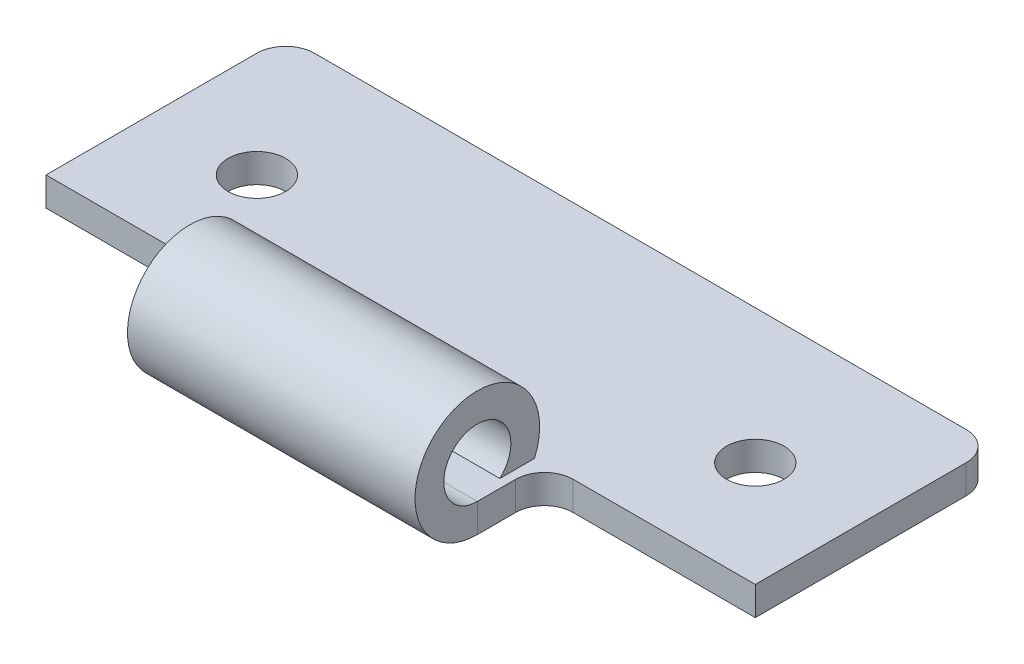
ISO-10303-21;
HEADER;
FILE_DESCRIPTION(('STEP AP214'),'2;1');
FILE_NAME('part.step','',(''),(''),'','','');
FILE_SCHEMA(('AUTOMOTIVE_DESIGN { 1 0 10303 214 1 1 1 1 }'));
ENDSEC;
DATA;
#1=APPLICATION_CONTEXT('core data for automotive mechanical design processes');
#2=APPLICATION_PROTOCOL_DEFINITION('international standard','automotive_design',2000,#1);
#3=PRODUCT_CONTEXT('',#1,'mechanical');
#4=PRODUCT('Part','Part','',(#3));
#5=PRODUCT_RELATED_PRODUCT_CATEGORY('part','',(#4));
#6=PRODUCT_DEFINITION_FORMATION('','',#4);
#7=PRODUCT_DEFINITION_CONTEXT('part definition',#1,'design');
#8=PRODUCT_DEFINITION('design','',#6,#7);
#9=PRODUCT_DEFINITION_SHAPE('','',#8);
#10=(LENGTH_UNIT() NAMED_UNIT(*) SI_UNIT(.MILLI.,.METRE.));
#11=(NAMED_UNIT(*) PLANE_ANGLE_UNIT() SI_UNIT($,.RADIAN.));
#12=(NAMED_UNIT(*) SI_UNIT($,.STERADIAN.) SOLID_ANGLE_UNIT());
#13=UNCERTAINTY_MEASURE_WITH_UNIT(LENGTH_MEASURE(1.E-05),#10,'distance_accuracy_value','');
#14=(GEOMETRIC_REPRESENTATION_CONTEXT(3) GLOBAL_UNCERTAINTY_ASSIGNED_CONTEXT((#13)) GLOBAL_UNIT_ASSIGNED_CONTEXT((#10,
#11,#12)) REPRESENTATION_CONTEXT('',''));
#15=CARTESIAN_POINT('',(0.,0.,0.));
#16=DIRECTION('',(0.,0.,1.));
#17=DIRECTION('',(1.,0.,0.));
#18=AXIS2_PLACEMENT_3D('',#15,#16,#17);
#19=CARTESIAN_POINT('',(11.,0.,2.));
#20=DIRECTION('',(0.,0.,-1.));
#21=DIRECTION('',(-1.,0.,0.));
#22=AXIS2_PLACEMENT_3D('',#19,#20,#21);
#23=PLANE('',#22);
#24=DIRECTION('',(0.,1.,0.));
#25=VECTOR('',#24,1.);
#26=CARTESIAN_POINT('',(26.,0.,2.));
#27=LINE('',#26,#25);
#28=CARTESIAN_POINT('',(26.,-1.5,2.));
#29=VERTEX_POINT('',#28);
#30=CARTESIAN_POINT('',(26.,0.,2.));
#31=VERTEX_POINT('',#30);
#32=EDGE_CURVE('E107',#29,#31,#27,.T.);
#33=ORIENTED_EDGE('',*,*,#32,.F.);
#34=DIRECTION('',(1.,0.,0.));
#35=VECTOR('',#34,1.);
#36=CARTESIAN_POINT('',(11.,-1.5,2.));
#37=LINE('',#36,#35);
#38=CARTESIAN_POINT('',(11.,-1.5,2.));
#39=VERTEX_POINT('',#38);
#40=EDGE_CURVE('E56',#39,#29,#37,.T.);
#41=ORIENTED_EDGE('',*,*,#40,.F.);
#42=DIRECTION('',(0.,1.,0.));
#43=VECTOR('',#42,1.);
#44=CARTESIAN_POINT('',(11.,0.,2.));
#45=LINE('',#44,#43);
#46=CARTESIAN_POINT('',(11.,0.,2.));
#47=VERTEX_POINT('',#46);
#48=EDGE_CURVE('E103',#39,#47,#45,.T.);
#49=ORIENTED_EDGE('',*,*,#48,.T.);
#50=DIRECTION('',(1.,0.,0.));
#51=VECTOR('',#50,1.);
#52=CARTESIAN_POINT('',(11.,0.,2.));
#53=LINE('',#52,#51);
#54=EDGE_CURVE('E12',#47,#31,#53,.T.);
#55=ORIENTED_EDGE('',*,*,#54,.T.);
#56=EDGE_LOOP('',(#33,#41,#49,#55));
#57=FACE_BOUND('',#56,.T.);
#58=ADVANCED_FACE('F46',(#57),#23,.T.);
#59=CARTESIAN_POINT('',(11.,1.75,2.));
#60=DIRECTION('',(1.,0.,0.));
#61=DIRECTION('',(0.,0.,-1.));
#62=AXIS2_PLACEMENT_3D('',#59,#60,#61);
#63=CYLINDRICAL_SURFACE('',#62,3.25);
#64=CARTESIAN_POINT('',(26.,1.75,2.));
#65=DIRECTION('',(1.,0.,0.));
#66=DIRECTION('',(0.,0.,1.));
#67=AXIS2_PLACEMENT_3D('',#64,#65,#66);
#68=CIRCLE('',#67,3.25);
#69=CARTESIAN_POINT('',(26.,0.451442364428964,-0.979303285518304));
#70=VERTEX_POINT('',#69);
#71=EDGE_CURVE('E93',#70,#29,#68,.T.);
#72=ORIENTED_EDGE('',*,*,#71,.F.);
#73=DIRECTION('',(1.,0.,0.));
#74=VECTOR('',#73,1.);
#75=CARTESIAN_POINT('',(11.,0.451442364428964,-0.979303285518304));
#76=LINE('',#75,#74);
#77=CARTESIAN_POINT('',(11.,0.451442364428964,-0.979303285518304));
#78=VERTEX_POINT('',#77);
#79=EDGE_CURVE('E88',#78,#70,#76,.T.);
#80=ORIENTED_EDGE('',*,*,#79,.F.);
#81=CARTESIAN_POINT('',(11.,1.75,2.));
#82=DIRECTION('',(1.,0.,0.));
#83=DIRECTION('',(0.,0.,1.));
#84=AXIS2_PLACEMENT_3D('',#81,#82,#83);
#85=CIRCLE('',#84,3.25);
#86=EDGE_CURVE('E91',#78,#39,#85,.T.);
#87=ORIENTED_EDGE('',*,*,#86,.T.);
#88=ORIENTED_EDGE('',*,*,#40,.T.);
#89=EDGE_LOOP('',(#72,#80,#87,#88));
#90=FACE_BOUND('',#89,.T.);
#91=ADVANCED_FACE('F90',(#90),#63,.T.);
#92=CARTESIAN_POINT('',(11.,0.451442364428964,0.826864003152165));
#93=DIRECTION('',(0.,-1.,0.));
#94=DIRECTION('',(0.,0.,-1.));
#95=AXIS2_PLACEMENT_3D('',#92,#93,#94);
#96=PLANE('',#95);
#97=DIRECTION('',(0.,0.,-1.));
#98=VECTOR('',#97,1.);
#99=CARTESIAN_POINT('',(26.,0.451442364428964,0.826864003152165));
#100=LINE('',#99,#98);
#101=CARTESIAN_POINT('',(26.,0.451442364428964,0.826864003152165));
#102=VERTEX_POINT('',#101);
#103=EDGE_CURVE('E112',#102,#70,#100,.T.);
#104=ORIENTED_EDGE('',*,*,#103,.F.);
#105=DIRECTION('',(1.,0.,0.));
#106=VECTOR('',#105,1.);
#107=CARTESIAN_POINT('',(11.,0.451442364428964,0.826864003152165));
#108=LINE('',#107,#106);
#109=CARTESIAN_POINT('',(11.,0.451442364428964,0.826864003152165));
#110=VERTEX_POINT('',#109);
#111=EDGE_CURVE('E50',#110,#102,#108,.T.);
#112=ORIENTED_EDGE('',*,*,#111,.F.);
#113=DIRECTION('',(0.,0.,-1.));
#114=VECTOR('',#113,1.);
#115=CARTESIAN_POINT('',(11.,0.451442364428964,0.826864003152165));
#116=LINE('',#115,#114);
#117=EDGE_CURVE('E101',#110,#78,#116,.T.);
#118=ORIENTED_EDGE('',*,*,#117,.T.);
#119=ORIENTED_EDGE('',*,*,#79,.T.);
#120=EDGE_LOOP('',(#104,#112,#118,#119));
#121=FACE_BOUND('',#120,.T.);
#122=ADVANCED_FACE('F105',(#121),#96,.T.);
#123=CARTESIAN_POINT('',(11.,1.75,2.));
#124=DIRECTION('',(1.,0.,0.));
#125=DIRECTION('',(0.,0.,-1.));
#126=AXIS2_PLACEMENT_3D('',#123,#124,#125);
#127=CYLINDRICAL_SURFACE('',#126,1.75);
#128=CARTESIAN_POINT('',(26.,1.75,2.));
#129=DIRECTION('',(-1.,0.,0.));
#130=DIRECTION('',(0.,0.,1.));
#131=AXIS2_PLACEMENT_3D('',#128,#129,#130);
#132=CIRCLE('',#131,1.75);
#133=EDGE_CURVE('E83',#31,#102,#132,.T.);
#134=ORIENTED_EDGE('',*,*,#133,.F.);
#135=ORIENTED_EDGE('',*,*,#54,.F.);
#136=CARTESIAN_POINT('',(11.,1.75,2.));
#137=DIRECTION('',(-1.,0.,0.));
#138=DIRECTION('',(0.,0.,1.));
#139=AXIS2_PLACEMENT_3D('',#136,#137,#138);
#140=CIRCLE('',#139,1.75);
#141=EDGE_CURVE('E85',#47,#110,#140,.T.);
#142=ORIENTED_EDGE('',*,*,#141,.T.);
#143=ORIENTED_EDGE('',*,*,#111,.T.);
#144=EDGE_LOOP('',(#134,#135,#142,#143));
#145=FACE_BOUND('',#144,.T.);
#146=ADVANCED_FACE('F48',(#145),#127,.F.);
#147=CARTESIAN_POINT('',(11.,1.75,2.));
#148=DIRECTION('',(-1.,0.,0.));
#149=DIRECTION('',(0.,0.,1.));
#150=AXIS2_PLACEMENT_3D('',#147,#148,#149);
#151=PLANE('',#150);
#152=ORIENTED_EDGE('',*,*,#141,.F.);
#153=ORIENTED_EDGE('',*,*,#48,.F.);
#154=ORIENTED_EDGE('',*,*,#86,.F.);
#155=ORIENTED_EDGE('',*,*,#117,.F.);
#156=EDGE_LOOP('',(#152,#153,#154,#155));
#157=FACE_BOUND('',#156,.T.);
#158=ADVANCED_FACE('F100',(#157),#151,.T.);
#159=CARTESIAN_POINT('',(26.,1.75,2.));
#160=DIRECTION('',(-1.,0.,0.));
#161=DIRECTION('',(0.,0.,1.));
#162=AXIS2_PLACEMENT_3D('',#159,#160,#161);
#163=PLANE('',#162);
#164=ORIENTED_EDGE('',*,*,#32,.T.);
#165=ORIENTED_EDGE('',*,*,#133,.T.);
#166=ORIENTED_EDGE('',*,*,#103,.T.);
#167=ORIENTED_EDGE('',*,*,#71,.T.);
#168=EDGE_LOOP('',(#164,#165,#166,#167));
#169=FACE_BOUND('',#168,.T.);
#170=ADVANCED_FACE('F119',(#169),#163,.F.);
#171=CLOSED_SHELL('',(#58,#91,#122,#146,#158,#170));
#172=MANIFOLD_SOLID_BREP('B2',#171);
#173=CARTESIAN_POINT('',(0.,-1.5,0.));
#174=DIRECTION('',(-1.,0.,0.));
#175=DIRECTION('',(0.,0.,1.));
#176=AXIS2_PLACEMENT_3D('',#173,#174,#175);
#177=PLANE('',#176);
#178=DIRECTION('',(0.,0.,1.));
#179=VECTOR('',#178,1.);
#180=CARTESIAN_POINT('',(0.,0.,0.));
#181=LINE('',#180,#179);
#182=CARTESIAN_POINT('',(0.,0.,-12.5));
#183=VERTEX_POINT('',#182);
#184=CARTESIAN_POINT('',(0.,0.,-1.5));
#185=VERTEX_POINT('',#184);
#186=EDGE_CURVE('E290',#183,#185,#181,.T.);
#187=ORIENTED_EDGE('',*,*,#186,.F.);
#188=DIRECTION('',(0.,1.,0.));
#189=VECTOR('',#188,1.);
#190=CARTESIAN_POINT('',(0.,-1.5,-12.5));
#191=LINE('',#190,#189);
#192=CARTESIAN_POINT('',(0.,-1.5,-12.5));
#193=VERTEX_POINT('',#192);
#194=EDGE_CURVE('E309',#183,#193,#191,.F.);
#195=ORIENTED_EDGE('',*,*,#194,.T.);
#196=DIRECTION('',(0.,0.,1.));
#197=VECTOR('',#196,1.);
#198=CARTESIAN_POINT('',(0.,-1.5,0.));
#199=LINE('',#198,#197);
#200=CARTESIAN_POINT('',(0.,-1.5,-1.5));
#201=VERTEX_POINT('',#200);
#202=EDGE_CURVE('E292',#193,#201,#199,.T.);
#203=ORIENTED_EDGE('',*,*,#202,.T.);
#204=DIRECTION('',(0.,1.,0.));
#205=VECTOR('',#204,1.);
#206=CARTESIAN_POINT('',(0.,-15.,-1.5));
#207=LINE('',#206,#205);
#208=EDGE_CURVE('E347',#201,#185,#207,.T.);
#209=ORIENTED_EDGE('',*,*,#208,.T.);
#210=EDGE_LOOP('',(#187,#195,#203,#209));
#211=FACE_BOUND('',#210,.T.);
#212=ADVANCED_FACE('F185',(#211),#177,.T.);
#213=CARTESIAN_POINT('',(0.,-1.5,-14.));
#214=DIRECTION('',(0.,0.,-1.));
#215=DIRECTION('',(-1.,0.,0.));
#216=AXIS2_PLACEMENT_3D('',#213,#214,#215);
#217=PLANE('',#216);
#218=DIRECTION('',(-1.,0.,0.));
#219=VECTOR('',#218,1.);
#220=CARTESIAN_POINT('',(0.,-1.5,-14.));
#221=LINE('',#220,#219);
#222=CARTESIAN_POINT('',(35.5,-1.5,-14.));
#223=VERTEX_POINT('',#222);
#224=CARTESIAN_POINT('',(1.5,-1.5,-14.));
#225=VERTEX_POINT('',#224);
#226=EDGE_CURVE('E302',#223,#225,#221,.T.);
#227=ORIENTED_EDGE('',*,*,#226,.T.);
#228=DIRECTION('',(0.,1.,0.));
#229=VECTOR('',#228,1.);
#230=CARTESIAN_POINT('',(1.5,-1.5,-14.));
#231=LINE('',#230,#229);
#232=CARTESIAN_POINT('',(1.5,0.,-14.));
#233=VERTEX_POINT('',#232);
#234=EDGE_CURVE('E301',#225,#233,#231,.T.);
#235=ORIENTED_EDGE('',*,*,#234,.T.);
#236=DIRECTION('',(-1.,0.,0.));
#237=VECTOR('',#236,1.);
#238=CARTESIAN_POINT('',(0.,0.,-14.));
#239=LINE('',#238,#237);
#240=CARTESIAN_POINT('',(35.5,0.,-14.));
#241=VERTEX_POINT('',#240);
#242=EDGE_CURVE('E289',#241,#233,#239,.T.);
#243=ORIENTED_EDGE('',*,*,#242,.F.);
#244=DIRECTION('',(0.,1.,0.));
#245=VECTOR('',#244,1.);
#246=CARTESIAN_POINT('',(35.5,-1.5,-14.));
#247=LINE('',#246,#245);
#248=EDGE_CURVE('E299',#241,#223,#247,.F.);
#249=ORIENTED_EDGE('',*,*,#248,.T.);
#250=EDGE_LOOP('',(#227,#235,#243,#249));
#251=FACE_BOUND('',#250,.T.);
#252=ADVANCED_FACE('F394',(#251),#217,.T.);
#253=CARTESIAN_POINT('',(37.,-1.5,0.));
#254=DIRECTION('',(1.,0.,0.));
#255=DIRECTION('',(0.,0.,-1.));
#256=AXIS2_PLACEMENT_3D('',#253,#254,#255);
#257=PLANE('',#256);
#258=DIRECTION('',(0.,0.,-1.));
#259=VECTOR('',#258,1.);
#260=CARTESIAN_POINT('',(37.,-1.5,0.));
#261=LINE('',#260,#259);
#262=CARTESIAN_POINT('',(37.,-1.5,-1.5));
#263=VERTEX_POINT('',#262);
#264=CARTESIAN_POINT('',(37.,-1.5,-12.5));
#265=VERTEX_POINT('',#264);
#266=EDGE_CURVE('E389',#263,#265,#261,.T.);
#267=ORIENTED_EDGE('',*,*,#266,.T.);
#268=DIRECTION('',(0.,1.,0.));
#269=VECTOR('',#268,1.);
#270=CARTESIAN_POINT('',(37.,-1.5,-12.5));
#271=LINE('',#270,#269);
#272=CARTESIAN_POINT('',(37.,0.,-12.5));
#273=VERTEX_POINT('',#272);
#274=EDGE_CURVE('E288',#265,#273,#271,.T.);
#275=ORIENTED_EDGE('',*,*,#274,.T.);
#276=DIRECTION('',(0.,0.,-1.));
#277=VECTOR('',#276,1.);
#278=CARTESIAN_POINT('',(37.,0.,0.));
#279=LINE('',#278,#277);
#280=CARTESIAN_POINT('',(37.,0.,-1.5));
#281=VERTEX_POINT('',#280);
#282=EDGE_CURVE('E283',#281,#273,#279,.T.);
#283=ORIENTED_EDGE('',*,*,#282,.F.);
#284=DIRECTION('',(0.,1.,0.));
#285=VECTOR('',#284,1.);
#286=CARTESIAN_POINT('',(37.,-15.,-1.5));
#287=LINE('',#286,#285);
#288=EDGE_CURVE('E271',#263,#281,#287,.T.);
#289=ORIENTED_EDGE('',*,*,#288,.F.);
#290=EDGE_LOOP('',(#267,#275,#283,#289));
#291=FACE_BOUND('',#290,.T.);
#292=ADVANCED_FACE('F286',(#291),#257,.T.);
#293=CARTESIAN_POINT('',(0.,-1.5,0.));
#294=DIRECTION('',(0.,-1.,0.));
#295=DIRECTION('',(0.,0.,-1.));
#296=AXIS2_PLACEMENT_3D('',#293,#294,#295);
#297=PLANE('',#296);
#298=ORIENTED_EDGE('',*,*,#202,.F.);
#299=CARTESIAN_POINT('',(1.5,-1.5,-12.5));
#300=DIRECTION('',(0.,-1.,0.));
#301=DIRECTION('',(0.,0.,-1.));
#302=AXIS2_PLACEMENT_3D('',#299,#300,#301);
#303=CIRCLE('',#302,1.5);
#304=EDGE_CURVE('E313',#193,#225,#303,.T.);
#305=ORIENTED_EDGE('',*,*,#304,.T.);
#306=ORIENTED_EDGE('',*,*,#226,.F.);
#307=CARTESIAN_POINT('',(35.5,-1.5,-12.5));
#308=DIRECTION('',(0.,-1.,0.));
#309=DIRECTION('',(0.,0.,-1.));
#310=AXIS2_PLACEMENT_3D('',#307,#308,#309);
#311=CIRCLE('',#310,1.5);
#312=EDGE_CURVE('E311',#223,#265,#311,.T.);
#313=ORIENTED_EDGE('',*,*,#312,.T.);
#314=ORIENTED_EDGE('',*,*,#266,.F.);
#315=DIRECTION('',(1.,0.,0.));
#316=VECTOR('',#315,1.);
#317=CARTESIAN_POINT('',(0.,-1.5,-1.49999999999999));
#318=LINE('',#317,#316);
#319=CARTESIAN_POINT('',(27.5,-1.5,-1.5));
#320=VERTEX_POINT('',#319);
#321=EDGE_CURVE('E274',#320,#263,#318,.T.);
#322=ORIENTED_EDGE('',*,*,#321,.F.);
#323=CARTESIAN_POINT('',(27.5,-1.5,0.));
#324=DIRECTION('',(0.,-1.,0.));
#325=DIRECTION('',(0.,0.,-1.));
#326=AXIS2_PLACEMENT_3D('',#323,#324,#325);
#327=CIRCLE('',#326,1.5);
#328=CARTESIAN_POINT('',(26.,-1.5,0.));
#329=VERTEX_POINT('',#328);
#330=EDGE_CURVE('E44',#320,#329,#327,.F.);
#331=ORIENTED_EDGE('',*,*,#330,.T.);
#332=DIRECTION('',(0.,0.,-1.));
#333=VECTOR('',#332,1.);
#334=CARTESIAN_POINT('',(26.,-1.5,0.));
#335=LINE('',#334,#333);
#336=CARTESIAN_POINT('',(26.,-1.5,2.));
#337=VERTEX_POINT('',#336);
#338=EDGE_CURVE('E361',#337,#329,#335,.T.);
#339=ORIENTED_EDGE('',*,*,#338,.F.);
#340=DIRECTION('',(1.,0.,0.));
#341=VECTOR('',#340,1.);
#342=CARTESIAN_POINT('',(11.,-1.5,2.));
#343=LINE('',#342,#341);
#344=CARTESIAN_POINT('',(11.,-1.5,2.));
#345=VERTEX_POINT('',#344);
#346=EDGE_CURVE('E374',#345,#337,#343,.T.);
#347=ORIENTED_EDGE('',*,*,#346,.F.);
#348=DIRECTION('',(0.,0.,-1.));
#349=VECTOR('',#348,1.);
#350=CARTESIAN_POINT('',(11.,-1.5,0.));
#351=LINE('',#350,#349);
#352=CARTESIAN_POINT('',(11.,-1.5,0.));
#353=VERTEX_POINT('',#352);
#354=EDGE_CURVE('E338',#345,#353,#351,.T.);
#355=ORIENTED_EDGE('',*,*,#354,.T.);
#356=CARTESIAN_POINT('',(9.5,-1.5,0.));
#357=DIRECTION('',(0.,-1.,0.));
#358=DIRECTION('',(0.,0.,-1.));
#359=AXIS2_PLACEMENT_3D('',#356,#357,#358);
#360=CIRCLE('',#359,1.5);
#361=CARTESIAN_POINT('',(9.5,-1.5,-1.5));
#362=VERTEX_POINT('',#361);
#363=EDGE_CURVE('E327',#353,#362,#360,.F.);
#364=ORIENTED_EDGE('',*,*,#363,.T.);
#365=DIRECTION('',(1.,0.,0.));
#366=VECTOR('',#365,1.);
#367=CARTESIAN_POINT('',(0.,-1.5,-1.5));
#368=LINE('',#367,#366);
#369=EDGE_CURVE('E336',#201,#362,#368,.T.);
#370=ORIENTED_EDGE('',*,*,#369,.F.);
#371=EDGE_LOOP('',(#298,#305,#306,#313,#314,#322,#331,#339,#347,#355,#364,#370));
#372=FACE_BOUND('',#371,.T.);
#373=CARTESIAN_POINT('',(31.5,-1.5,-7.));
#374=DIRECTION('',(0.,1.,0.));
#375=DIRECTION('',(0.,0.,1.));
#376=AXIS2_PLACEMENT_3D('',#373,#374,#375);
#377=CIRCLE('',#376,1.5);
#378=CARTESIAN_POINT('',(31.5,-1.5,-5.5));
#379=VERTEX_POINT('',#378);
#380=EDGE_CURVE('E378',#379,#379,#377,.T.);
#381=ORIENTED_EDGE('',*,*,#380,.T.);
#382=EDGE_LOOP('',(#381));
#383=FACE_BOUND('',#382,.T.);
#384=CARTESIAN_POINT('',(5.5,-1.5,-7.));
#385=DIRECTION('',(0.,1.,0.));
#386=DIRECTION('',(0.,0.,1.));
#387=AXIS2_PLACEMENT_3D('',#384,#385,#386);
#388=CIRCLE('',#387,1.5);
#389=CARTESIAN_POINT('',(5.5,-1.5,-5.5));
#390=VERTEX_POINT('',#389);
#391=EDGE_CURVE('E295',#390,#390,#388,.T.);
#392=ORIENTED_EDGE('',*,*,#391,.T.);
#393=EDGE_LOOP('',(#392));
#394=FACE_BOUND('',#393,.T.);
#395=ADVANCED_FACE('F334',(#372,#383,#394),#297,.T.);
#396=CARTESIAN_POINT('',(0.,0.,0.));
#397=DIRECTION('',(0.,-1.,0.));
#398=DIRECTION('',(0.,0.,-1.));
#399=AXIS2_PLACEMENT_3D('',#396,#397,#398);
#400=PLANE('',#399);
#401=CARTESIAN_POINT('',(31.5,0.,-7.));
#402=DIRECTION('',(0.,1.,0.));
#403=DIRECTION('',(0.,0.,1.));
#404=AXIS2_PLACEMENT_3D('',#401,#402,#403);
#405=CIRCLE('',#404,1.5);
#406=CARTESIAN_POINT('',(31.5,0.,-5.5));
#407=VERTEX_POINT('',#406);
#408=EDGE_CURVE('E376',#407,#407,#405,.T.);
#409=ORIENTED_EDGE('',*,*,#408,.F.);
#410=EDGE_LOOP('',(#409));
#411=FACE_BOUND('',#410,.T.);
#412=CARTESIAN_POINT('',(5.5,0.,-7.));
#413=DIRECTION('',(0.,1.,0.));
#414=DIRECTION('',(0.,0.,1.));
#415=AXIS2_PLACEMENT_3D('',#412,#413,#414);
#416=CIRCLE('',#415,1.5);
#417=CARTESIAN_POINT('',(5.5,0.,-5.5));
#418=VERTEX_POINT('',#417);
#419=EDGE_CURVE('E381',#418,#418,#416,.T.);
#420=ORIENTED_EDGE('',*,*,#419,.F.);
#421=EDGE_LOOP('',(#420));
#422=FACE_BOUND('',#421,.T.);
#423=ORIENTED_EDGE('',*,*,#242,.T.);
#424=CARTESIAN_POINT('',(1.5,0.,-12.5));
#425=DIRECTION('',(0.,-1.,0.));
#426=DIRECTION('',(0.,0.,-1.));
#427=AXIS2_PLACEMENT_3D('',#424,#425,#426);
#428=CIRCLE('',#427,1.5);
#429=EDGE_CURVE('E307',#233,#183,#428,.F.);
#430=ORIENTED_EDGE('',*,*,#429,.T.);
#431=ORIENTED_EDGE('',*,*,#186,.T.);
#432=DIRECTION('',(-1.,0.,0.));
#433=VECTOR('',#432,1.);
#434=CARTESIAN_POINT('',(0.,0.,-1.5));
#435=LINE('',#434,#433);
#436=CARTESIAN_POINT('',(9.5,0.,-1.5));
#437=VERTEX_POINT('',#436);
#438=EDGE_CURVE('E355',#437,#185,#435,.T.);
#439=ORIENTED_EDGE('',*,*,#438,.F.);
#440=CARTESIAN_POINT('',(9.5,0.,0.));
#441=DIRECTION('',(0.,-1.,0.));
#442=DIRECTION('',(0.,0.,-1.));
#443=AXIS2_PLACEMENT_3D('',#440,#441,#442);
#444=CIRCLE('',#443,1.5);
#445=CARTESIAN_POINT('',(11.,0.,0.));
#446=VERTEX_POINT('',#445);
#447=EDGE_CURVE('E325',#437,#446,#444,.T.);
#448=ORIENTED_EDGE('',*,*,#447,.T.);
#449=DIRECTION('',(0.,0.,1.));
#450=VECTOR('',#449,1.);
#451=CARTESIAN_POINT('',(11.,0.,0.));
#452=LINE('',#451,#450);
#453=CARTESIAN_POINT('',(11.,0.,2.));
#454=VERTEX_POINT('',#453);
#455=EDGE_CURVE('E353',#446,#454,#452,.T.);
#456=ORIENTED_EDGE('',*,*,#455,.T.);
#457=DIRECTION('',(1.,0.,0.));
#458=VECTOR('',#457,1.);
#459=CARTESIAN_POINT('',(11.,0.,2.));
#460=LINE('',#459,#458);
#461=CARTESIAN_POINT('',(26.,0.,2.));
#462=VERTEX_POINT('',#461);
#463=EDGE_CURVE('E370',#454,#462,#460,.T.);
#464=ORIENTED_EDGE('',*,*,#463,.T.);
#465=DIRECTION('',(0.,0.,1.));
#466=VECTOR('',#465,1.);
#467=CARTESIAN_POINT('',(26.,0.,0.));
#468=LINE('',#467,#466);
#469=CARTESIAN_POINT('',(26.,0.,0.));
#470=VERTEX_POINT('',#469);
#471=EDGE_CURVE('E348',#470,#462,#468,.T.);
#472=ORIENTED_EDGE('',*,*,#471,.F.);
#473=CARTESIAN_POINT('',(27.5,0.,0.));
#474=DIRECTION('',(0.,-1.,0.));
#475=DIRECTION('',(0.,0.,-1.));
#476=AXIS2_PLACEMENT_3D('',#473,#474,#475);
#477=CIRCLE('',#476,1.5);
#478=CARTESIAN_POINT('',(27.5,0.,-1.5));
#479=VERTEX_POINT('',#478);
#480=EDGE_CURVE('E193',#470,#479,#477,.T.);
#481=ORIENTED_EDGE('',*,*,#480,.T.);
#482=DIRECTION('',(-1.,0.,0.));
#483=VECTOR('',#482,1.);
#484=CARTESIAN_POINT('',(37.,0.,-1.5));
#485=LINE('',#484,#483);
#486=EDGE_CURVE('E273',#281,#479,#485,.T.);
#487=ORIENTED_EDGE('',*,*,#486,.F.);
#488=ORIENTED_EDGE('',*,*,#282,.T.);
#489=CARTESIAN_POINT('',(35.5,0.,-12.5));
#490=DIRECTION('',(0.,-1.,0.));
#491=DIRECTION('',(0.,0.,-1.));
#492=AXIS2_PLACEMENT_3D('',#489,#490,#491);
#493=CIRCLE('',#492,1.5);
#494=EDGE_CURVE('E305',#273,#241,#493,.F.);
#495=ORIENTED_EDGE('',*,*,#494,.T.);
#496=EDGE_LOOP('',(#423,#430,#431,#439,#448,#456,#464,#472,#481,#487,#488,#495));
#497=FACE_BOUND('',#496,.T.);
#498=ADVANCED_FACE('F282',(#411,#422,#497),#400,.F.);
#499=CARTESIAN_POINT('',(5.5,-1.5,-7.));
#500=DIRECTION('',(0.,1.,0.));
#501=DIRECTION('',(0.,0.,1.));
#502=AXIS2_PLACEMENT_3D('',#499,#500,#501);
#503=CYLINDRICAL_SURFACE('',#502,1.5);
#504=ORIENTED_EDGE('',*,*,#391,.F.);
#505=EDGE_LOOP('',(#504));
#506=FACE_BOUND('',#505,.T.);
#507=ORIENTED_EDGE('',*,*,#419,.T.);
#508=EDGE_LOOP('',(#507));
#509=FACE_BOUND('',#508,.T.);
#510=ADVANCED_FACE('F442',(#506,#509),#503,.F.);
#511=CARTESIAN_POINT('',(31.5,-1.5,-7.));
#512=DIRECTION('',(0.,1.,0.));
#513=DIRECTION('',(0.,0.,1.));
#514=AXIS2_PLACEMENT_3D('',#511,#512,#513);
#515=CYLINDRICAL_SURFACE('',#514,1.5);
#516=ORIENTED_EDGE('',*,*,#380,.F.);
#517=EDGE_LOOP('',(#516));
#518=FACE_BOUND('',#517,.T.);
#519=ORIENTED_EDGE('',*,*,#408,.T.);
#520=EDGE_LOOP('',(#519));
#521=FACE_BOUND('',#520,.T.);
#522=ADVANCED_FACE('F436',(#518,#521),#515,.F.);
#523=CARTESIAN_POINT('',(11.,0.,2.));
#524=DIRECTION('',(0.,0.,1.));
#525=DIRECTION('',(1.,0.,0.));
#526=AXIS2_PLACEMENT_3D('',#523,#524,#525);
#527=PLANE('',#526);
#528=DIRECTION('',(0.,-1.,0.));
#529=VECTOR('',#528,1.);
#530=CARTESIAN_POINT('',(26.,0.,2.));
#531=LINE('',#530,#529);
#532=EDGE_CURVE('E365',#462,#337,#531,.T.);
#533=ORIENTED_EDGE('',*,*,#532,.F.);
#534=ORIENTED_EDGE('',*,*,#463,.F.);
#535=DIRECTION('',(0.,-1.,0.));
#536=VECTOR('',#535,1.);
#537=CARTESIAN_POINT('',(11.,0.,2.));
#538=LINE('',#537,#536);
#539=EDGE_CURVE('E360',#454,#345,#538,.T.);
#540=ORIENTED_EDGE('',*,*,#539,.T.);
#541=ORIENTED_EDGE('',*,*,#346,.T.);
#542=EDGE_LOOP('',(#533,#534,#540,#541));
#543=FACE_BOUND('',#542,.T.);
#544=ADVANCED_FACE('F434',(#543),#527,.T.);
#545=CARTESIAN_POINT('',(11.,0.,0.));
#546=DIRECTION('',(-1.,0.,0.));
#547=DIRECTION('',(0.,0.,1.));
#548=AXIS2_PLACEMENT_3D('',#545,#546,#547);
#549=PLANE('',#548);
#550=ORIENTED_EDGE('',*,*,#455,.F.);
#551=DIRECTION('',(0.,1.,0.));
#552=VECTOR('',#551,1.);
#553=CARTESIAN_POINT('',(11.,0.,0.));
#554=LINE('',#553,#552);
#555=EDGE_CURVE('E319',#446,#353,#554,.F.);
#556=ORIENTED_EDGE('',*,*,#555,.T.);
#557=ORIENTED_EDGE('',*,*,#354,.F.);
#558=ORIENTED_EDGE('',*,*,#539,.F.);
#559=EDGE_LOOP('',(#550,#556,#557,#558));
#560=FACE_BOUND('',#559,.T.);
#561=ADVANCED_FACE('F358',(#560),#549,.T.);
#562=CARTESIAN_POINT('',(26.,0.,0.));
#563=DIRECTION('',(-1.,0.,0.));
#564=DIRECTION('',(0.,0.,1.));
#565=AXIS2_PLACEMENT_3D('',#562,#563,#564);
#566=PLANE('',#565);
#567=ORIENTED_EDGE('',*,*,#338,.T.);
#568=DIRECTION('',(0.,1.,0.));
#569=VECTOR('',#568,1.);
#570=CARTESIAN_POINT('',(26.,0.,0.));
#571=LINE('',#570,#569);
#572=EDGE_CURVE('E321',#329,#470,#571,.T.);
#573=ORIENTED_EDGE('',*,*,#572,.T.);
#574=ORIENTED_EDGE('',*,*,#471,.T.);
#575=ORIENTED_EDGE('',*,*,#532,.T.);
#576=EDGE_LOOP('',(#567,#573,#574,#575));
#577=FACE_BOUND('',#576,.T.);
#578=ADVANCED_FACE('F431',(#577),#566,.F.);
#579=CARTESIAN_POINT('',(0.,-15.,-1.5));
#580=DIRECTION('',(0.,0.,-1.));
#581=DIRECTION('',(-1.,0.,0.));
#582=AXIS2_PLACEMENT_3D('',#579,#580,#581);
#583=PLANE('',#582);
#584=ORIENTED_EDGE('',*,*,#369,.T.);
#585=DIRECTION('',(0.,1.,0.));
#586=VECTOR('',#585,1.);
#587=CARTESIAN_POINT('',(9.5,-15.,-1.5));
#588=LINE('',#587,#586);
#589=EDGE_CURVE('E316',#362,#437,#588,.T.);
#590=ORIENTED_EDGE('',*,*,#589,.T.);
#591=ORIENTED_EDGE('',*,*,#438,.T.);
#592=ORIENTED_EDGE('',*,*,#208,.F.);
#593=EDGE_LOOP('',(#584,#590,#591,#592));
#594=FACE_BOUND('',#593,.T.);
#595=ADVANCED_FACE('F344',(#594),#583,.F.);
#596=CARTESIAN_POINT('',(37.,-15.,-1.5));
#597=DIRECTION('',(0.,0.,-1.));
#598=DIRECTION('',(-1.,0.,0.));
#599=AXIS2_PLACEMENT_3D('',#596,#597,#598);
#600=PLANE('',#599);
#601=ORIENTED_EDGE('',*,*,#486,.T.);
#602=DIRECTION('',(0.,1.,0.));
#603=VECTOR('',#602,1.);
#604=CARTESIAN_POINT('',(27.5,-1.5,-1.5));
#605=LINE('',#604,#603);
#606=EDGE_CURVE('E206',#479,#320,#605,.F.);
#607=ORIENTED_EDGE('',*,*,#606,.T.);
#608=ORIENTED_EDGE('',*,*,#321,.T.);
#609=ORIENTED_EDGE('',*,*,#288,.T.);
#610=EDGE_LOOP('',(#601,#607,#608,#609));
#611=FACE_BOUND('',#610,.T.);
#612=ADVANCED_FACE('F272',(#611),#600,.F.);
#613=CARTESIAN_POINT('',(1.5,-1.5,-12.5));
#614=DIRECTION('',(0.,1.,0.));
#615=DIRECTION('',(0.,0.,1.));
#616=AXIS2_PLACEMENT_3D('',#613,#614,#615);
#617=CYLINDRICAL_SURFACE('',#616,1.5);
#618=ORIENTED_EDGE('',*,*,#304,.F.);
#619=ORIENTED_EDGE('',*,*,#194,.F.);
#620=ORIENTED_EDGE('',*,*,#429,.F.);
#621=ORIENTED_EDGE('',*,*,#234,.F.);
#622=EDGE_LOOP('',(#618,#619,#620,#621));
#623=FACE_BOUND('',#622,.T.);
#624=ADVANCED_FACE('F400',(#623),#617,.T.);
#625=CARTESIAN_POINT('',(35.5,-1.5,-12.5));
#626=DIRECTION('',(0.,1.,0.));
#627=DIRECTION('',(0.,0.,1.));
#628=AXIS2_PLACEMENT_3D('',#625,#626,#627);
#629=CYLINDRICAL_SURFACE('',#628,1.5);
#630=ORIENTED_EDGE('',*,*,#312,.F.);
#631=ORIENTED_EDGE('',*,*,#248,.F.);
#632=ORIENTED_EDGE('',*,*,#494,.F.);
#633=ORIENTED_EDGE('',*,*,#274,.F.);
#634=EDGE_LOOP('',(#630,#631,#632,#633));
#635=FACE_BOUND('',#634,.T.);
#636=ADVANCED_FACE('F417',(#635),#629,.T.);
#637=CARTESIAN_POINT('',(9.5,-15.,0.));
#638=DIRECTION('',(0.,1.,0.));
#639=DIRECTION('',(0.,0.,1.));
#640=AXIS2_PLACEMENT_3D('',#637,#638,#639);
#641=CYLINDRICAL_SURFACE('',#640,1.5);
#642=ORIENTED_EDGE('',*,*,#363,.F.);
#643=ORIENTED_EDGE('',*,*,#555,.F.);
#644=ORIENTED_EDGE('',*,*,#447,.F.);
#645=ORIENTED_EDGE('',*,*,#589,.F.);
#646=EDGE_LOOP('',(#642,#643,#644,#645));
#647=FACE_BOUND('',#646,.T.);
#648=ADVANCED_FACE('F350',(#647),#641,.F.);
#649=CARTESIAN_POINT('',(27.5,0.,0.));
#650=DIRECTION('',(0.,-1.,0.));
#651=DIRECTION('',(0.,0.,-1.));
#652=AXIS2_PLACEMENT_3D('',#649,#650,#651);
#653=CYLINDRICAL_SURFACE('',#652,1.5);
#654=ORIENTED_EDGE('',*,*,#330,.F.);
#655=ORIENTED_EDGE('',*,*,#606,.F.);
#656=ORIENTED_EDGE('',*,*,#480,.F.);
#657=ORIENTED_EDGE('',*,*,#572,.F.);
#658=EDGE_LOOP('',(#654,#655,#656,#657));
#659=FACE_BOUND('',#658,.T.);
#660=ADVANCED_FACE('F187',(#659),#653,.F.);
#661=CLOSED_SHELL('',(#212,#252,#292,#395,#498,#510,#522,#544,#561,#578,#595,#612,#624,#636,
#648,#660));
#662=MANIFOLD_SOLID_BREP('B6',#661);
#663=ADVANCED_BREP_SHAPE_REPRESENTATION('',(#18,#172,#662),#14);
#664=SHAPE_DEFINITION_REPRESENTATION(#9,#663);
ENDSEC;
END-ISO-10303-21;
